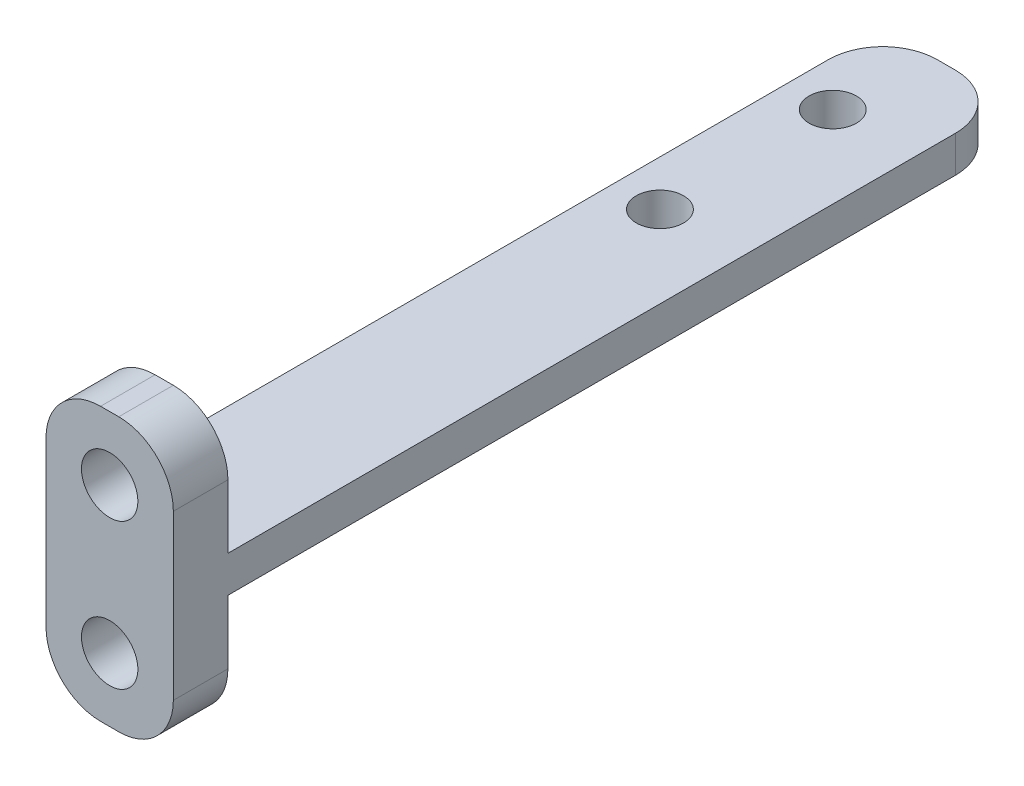
ISO-10303-21;
HEADER;
FILE_DESCRIPTION(('STEP AP214'),'2;1');
FILE_NAME('part.step','',(''),(''),'','','');
FILE_SCHEMA(('AUTOMOTIVE_DESIGN { 1 0 10303 214 1 1 1 1 }'));
ENDSEC;
DATA;
#1=APPLICATION_CONTEXT('core data for automotive mechanical design processes');
#2=APPLICATION_PROTOCOL_DEFINITION('international standard','automotive_design',2000,#1);
#3=PRODUCT_CONTEXT('',#1,'mechanical');
#4=PRODUCT('Part','Part','',(#3));
#5=PRODUCT_RELATED_PRODUCT_CATEGORY('part','',(#4));
#6=PRODUCT_DEFINITION_FORMATION('','',#4);
#7=PRODUCT_DEFINITION_CONTEXT('part definition',#1,'design');
#8=PRODUCT_DEFINITION('design','',#6,#7);
#9=PRODUCT_DEFINITION_SHAPE('','',#8);
#10=(LENGTH_UNIT() NAMED_UNIT(*) SI_UNIT(.MILLI.,.METRE.));
#11=(NAMED_UNIT(*) PLANE_ANGLE_UNIT() SI_UNIT($,.RADIAN.));
#12=(NAMED_UNIT(*) SI_UNIT($,.STERADIAN.) SOLID_ANGLE_UNIT());
#13=UNCERTAINTY_MEASURE_WITH_UNIT(LENGTH_MEASURE(1.E-05),#10,'distance_accuracy_value','');
#14=(GEOMETRIC_REPRESENTATION_CONTEXT(3) GLOBAL_UNCERTAINTY_ASSIGNED_CONTEXT((#13)) GLOBAL_UNIT_ASSIGNED_CONTEXT((#10,
#11,#12)) REPRESENTATION_CONTEXT('',''));
#15=CARTESIAN_POINT('',(0.,0.,0.));
#16=DIRECTION('',(0.,0.,1.));
#17=DIRECTION('',(1.,0.,0.));
#18=AXIS2_PLACEMENT_3D('',#15,#16,#17);
#19=CARTESIAN_POINT('',(0.,2.,0.));
#20=DIRECTION('',(0.,1.,0.));
#21=DIRECTION('',(0.,0.,1.));
#22=AXIS2_PLACEMENT_3D('',#19,#20,#21);
#23=PLANE('',#22);
#24=CARTESIAN_POINT('',(-1.,2.,-16.25));
#25=DIRECTION('',(0.,1.,0.));
#26=DIRECTION('',(0.,0.,1.));
#27=AXIS2_PLACEMENT_3D('',#24,#25,#26);
#28=CIRCLE('',#27,1.3);
#29=CARTESIAN_POINT('',(-1.,2.,-14.95));
#30=VERTEX_POINT('',#29);
#31=EDGE_CURVE('E173',#30,#30,#28,.T.);
#32=ORIENTED_EDGE('',*,*,#31,.F.);
#33=EDGE_LOOP('',(#32));
#34=FACE_BOUND('',#33,.T.);
#35=DIRECTION('',(-1.,0.,0.));
#36=VECTOR('',#35,1.);
#37=CARTESIAN_POINT('',(3.5,2.,-21.5));
#38=LINE('',#37,#36);
#39=CARTESIAN_POINT('',(0.5,2.,-21.5));
#40=VERTEX_POINT('',#39);
#41=CARTESIAN_POINT('',(-0.5,2.,-21.5));
#42=VERTEX_POINT('',#41);
#43=EDGE_CURVE('E199',#40,#42,#38,.T.);
#44=ORIENTED_EDGE('',*,*,#43,.T.);
#45=CARTESIAN_POINT('',(-0.5,2.,-18.5));
#46=DIRECTION('',(0.,1.,0.));
#47=DIRECTION('',(0.,0.,1.));
#48=AXIS2_PLACEMENT_3D('',#45,#46,#47);
#49=CIRCLE('',#48,3.);
#50=CARTESIAN_POINT('',(-3.5,2.,-18.5));
#51=VERTEX_POINT('',#50);
#52=EDGE_CURVE('E215',#42,#51,#49,.T.);
#53=ORIENTED_EDGE('',*,*,#52,.T.);
#54=DIRECTION('',(0.,0.,1.));
#55=VECTOR('',#54,1.);
#56=CARTESIAN_POINT('',(-3.5,2.,21.5));
#57=LINE('',#56,#55);
#58=CARTESIAN_POINT('',(-3.5,2.,21.5));
#59=VERTEX_POINT('',#58);
#60=EDGE_CURVE('E189',#51,#59,#57,.T.);
#61=ORIENTED_EDGE('',*,*,#60,.T.);
#62=DIRECTION('',(1.,0.,0.));
#63=VECTOR('',#62,1.);
#64=CARTESIAN_POINT('',(3.5,2.,21.5));
#65=LINE('',#64,#63);
#66=CARTESIAN_POINT('',(3.5,2.,21.5));
#67=VERTEX_POINT('',#66);
#68=EDGE_CURVE('E327',#59,#67,#65,.T.);
#69=ORIENTED_EDGE('',*,*,#68,.T.);
#70=DIRECTION('',(0.,0.,-1.));
#71=VECTOR('',#70,1.);
#72=CARTESIAN_POINT('',(3.5,2.,21.5));
#73=LINE('',#72,#71);
#74=CARTESIAN_POINT('',(3.5,2.,-18.5));
#75=VERTEX_POINT('',#74);
#76=EDGE_CURVE('E276',#67,#75,#73,.T.);
#77=ORIENTED_EDGE('',*,*,#76,.T.);
#78=CARTESIAN_POINT('',(0.5,2.,-18.5));
#79=DIRECTION('',(0.,1.,0.));
#80=DIRECTION('',(0.,0.,1.));
#81=AXIS2_PLACEMENT_3D('',#78,#79,#80);
#82=CIRCLE('',#81,3.);
#83=EDGE_CURVE('E212',#75,#40,#82,.T.);
#84=ORIENTED_EDGE('',*,*,#83,.T.);
#85=EDGE_LOOP('',(#44,#53,#61,#69,#77,#84));
#86=FACE_BOUND('',#85,.T.);
#87=CARTESIAN_POINT('',(-0.999999999999999,2.,-6.75000000000001));
#88=DIRECTION('',(0.,1.,0.));
#89=DIRECTION('',(0.,0.,-1.));
#90=AXIS2_PLACEMENT_3D('',#87,#88,#89);
#91=CIRCLE('',#90,1.3);
#92=CARTESIAN_POINT('',(-0.999999999999999,2.,-8.05000000000001));
#93=VERTEX_POINT('',#92);
#94=EDGE_CURVE('E311',#93,#93,#91,.T.);
#95=ORIENTED_EDGE('',*,*,#94,.F.);
#96=EDGE_LOOP('',(#95));
#97=FACE_BOUND('',#96,.T.);
#98=ADVANCED_FACE('F45',(#34,#86,#97),#23,.T.);
#99=CARTESIAN_POINT('',(0.,0.,0.));
#100=DIRECTION('',(0.,1.,0.));
#101=DIRECTION('',(0.,0.,1.));
#102=AXIS2_PLACEMENT_3D('',#99,#100,#101);
#103=PLANE('',#102);
#104=DIRECTION('',(0.,0.,1.));
#105=VECTOR('',#104,1.);
#106=CARTESIAN_POINT('',(-3.5,0.,21.5));
#107=LINE('',#106,#105);
#108=CARTESIAN_POINT('',(-3.5,0.,-18.5));
#109=VERTEX_POINT('',#108);
#110=CARTESIAN_POINT('',(-3.5,0.,21.5));
#111=VERTEX_POINT('',#110);
#112=EDGE_CURVE('E166',#109,#111,#107,.T.);
#113=ORIENTED_EDGE('',*,*,#112,.F.);
#114=CARTESIAN_POINT('',(-0.5,0.,-18.5));
#115=DIRECTION('',(0.,1.,0.));
#116=DIRECTION('',(0.,0.,1.));
#117=AXIS2_PLACEMENT_3D('',#114,#115,#116);
#118=CIRCLE('',#117,3.);
#119=CARTESIAN_POINT('',(-0.5,0.,-21.5));
#120=VERTEX_POINT('',#119);
#121=EDGE_CURVE('E202',#109,#120,#118,.F.);
#122=ORIENTED_EDGE('',*,*,#121,.T.);
#123=DIRECTION('',(-1.,0.,0.));
#124=VECTOR('',#123,1.);
#125=CARTESIAN_POINT('',(3.5,0.,-21.5));
#126=LINE('',#125,#124);
#127=CARTESIAN_POINT('',(0.5,0.,-21.5));
#128=VERTEX_POINT('',#127);
#129=EDGE_CURVE('E182',#128,#120,#126,.T.);
#130=ORIENTED_EDGE('',*,*,#129,.F.);
#131=CARTESIAN_POINT('',(0.5,0.,-18.5));
#132=DIRECTION('',(0.,1.,0.));
#133=DIRECTION('',(0.,0.,1.));
#134=AXIS2_PLACEMENT_3D('',#131,#132,#133);
#135=CIRCLE('',#134,3.);
#136=CARTESIAN_POINT('',(3.5,0.,-18.5));
#137=VERTEX_POINT('',#136);
#138=EDGE_CURVE('E198',#128,#137,#135,.F.);
#139=ORIENTED_EDGE('',*,*,#138,.T.);
#140=DIRECTION('',(0.,0.,-1.));
#141=VECTOR('',#140,1.);
#142=CARTESIAN_POINT('',(3.5,0.,21.5));
#143=LINE('',#142,#141);
#144=CARTESIAN_POINT('',(3.5,0.,21.5));
#145=VERTEX_POINT('',#144);
#146=EDGE_CURVE('E178',#145,#137,#143,.T.);
#147=ORIENTED_EDGE('',*,*,#146,.F.);
#148=DIRECTION('',(1.,0.,0.));
#149=VECTOR('',#148,1.);
#150=CARTESIAN_POINT('',(3.5,0.,21.5));
#151=LINE('',#150,#149);
#152=EDGE_CURVE('E153',#111,#145,#151,.T.);
#153=ORIENTED_EDGE('',*,*,#152,.F.);
#154=EDGE_LOOP('',(#113,#122,#130,#139,#147,#153));
#155=FACE_BOUND('',#154,.T.);
#156=CARTESIAN_POINT('',(-1.,0.,-16.25));
#157=DIRECTION('',(0.,1.,0.));
#158=DIRECTION('',(0.,0.,1.));
#159=AXIS2_PLACEMENT_3D('',#156,#157,#158);
#160=CIRCLE('',#159,1.3);
#161=CARTESIAN_POINT('',(-1.,0.,-14.95));
#162=VERTEX_POINT('',#161);
#163=EDGE_CURVE('E315',#162,#162,#160,.T.);
#164=ORIENTED_EDGE('',*,*,#163,.T.);
#165=EDGE_LOOP('',(#164));
#166=FACE_BOUND('',#165,.T.);
#167=CARTESIAN_POINT('',(-0.999999999999999,0.,-6.75000000000001));
#168=DIRECTION('',(0.,1.,0.));
#169=DIRECTION('',(0.,0.,-1.));
#170=AXIS2_PLACEMENT_3D('',#167,#168,#169);
#171=CIRCLE('',#170,1.3);
#172=CARTESIAN_POINT('',(-0.999999999999999,0.,-8.05000000000001));
#173=VERTEX_POINT('',#172);
#174=EDGE_CURVE('E306',#173,#173,#171,.T.);
#175=ORIENTED_EDGE('',*,*,#174,.T.);
#176=EDGE_LOOP('',(#175));
#177=FACE_BOUND('',#176,.T.);
#178=ADVANCED_FACE('F175',(#155,#166,#177),#103,.F.);
#179=CARTESIAN_POINT('',(-3.5,2.,21.5));
#180=DIRECTION('',(1.,0.,0.));
#181=DIRECTION('',(0.,0.,-1.));
#182=AXIS2_PLACEMENT_3D('',#179,#180,#181);
#183=PLANE('',#182);
#184=DIRECTION('',(0.,1.,0.));
#185=VECTOR('',#184,1.);
#186=CARTESIAN_POINT('',(-3.5,-6.5,21.5));
#187=LINE('',#186,#185);
#188=CARTESIAN_POINT('',(-3.5,-3.5,21.5));
#189=VERTEX_POINT('',#188);
#190=EDGE_CURVE('E147',#189,#111,#187,.T.);
#191=ORIENTED_EDGE('',*,*,#190,.F.);
#192=DIRECTION('',(0.,0.,1.));
#193=VECTOR('',#192,1.);
#194=CARTESIAN_POINT('',(-3.5,-3.5,24.5));
#195=LINE('',#194,#193);
#196=CARTESIAN_POINT('',(-3.5,-3.5,24.5));
#197=VERTEX_POINT('',#196);
#198=EDGE_CURVE('E224',#189,#197,#195,.T.);
#199=ORIENTED_EDGE('',*,*,#198,.T.);
#200=DIRECTION('',(0.,1.,0.));
#201=VECTOR('',#200,1.);
#202=CARTESIAN_POINT('',(-3.5,-6.5,24.5));
#203=LINE('',#202,#201);
#204=CARTESIAN_POINT('',(-3.5,5.5,24.5));
#205=VERTEX_POINT('',#204);
#206=EDGE_CURVE('E161',#197,#205,#203,.T.);
#207=ORIENTED_EDGE('',*,*,#206,.T.);
#208=DIRECTION('',(0.,0.,1.));
#209=VECTOR('',#208,1.);
#210=CARTESIAN_POINT('',(-3.5,5.5,21.5));
#211=LINE('',#210,#209);
#212=CARTESIAN_POINT('',(-3.5,5.5,21.5));
#213=VERTEX_POINT('',#212);
#214=EDGE_CURVE('E221',#205,#213,#211,.F.);
#215=ORIENTED_EDGE('',*,*,#214,.T.);
#216=EDGE_CURVE('E162',#59,#213,#187,.T.);
#217=ORIENTED_EDGE('',*,*,#216,.F.);
#218=ORIENTED_EDGE('',*,*,#60,.F.);
#219=DIRECTION('',(0.,-1.,0.));
#220=VECTOR('',#219,1.);
#221=CARTESIAN_POINT('',(-3.5,2.,-18.5));
#222=LINE('',#221,#220);
#223=EDGE_CURVE('E170',#51,#109,#222,.T.);
#224=ORIENTED_EDGE('',*,*,#223,.T.);
#225=ORIENTED_EDGE('',*,*,#112,.T.);
#226=EDGE_LOOP('',(#191,#199,#207,#215,#217,#218,#224,#225));
#227=FACE_BOUND('',#226,.T.);
#228=ADVANCED_FACE('F167',(#227),#183,.F.);
#229=CARTESIAN_POINT('',(3.5,2.,21.5));
#230=DIRECTION('',(-1.,0.,0.));
#231=DIRECTION('',(0.,0.,1.));
#232=AXIS2_PLACEMENT_3D('',#229,#230,#231);
#233=PLANE('',#232);
#234=DIRECTION('',(0.,1.,0.));
#235=VECTOR('',#234,1.);
#236=CARTESIAN_POINT('',(3.5,-6.5,24.5));
#237=LINE('',#236,#235);
#238=CARTESIAN_POINT('',(3.5,-3.5,24.5));
#239=VERTEX_POINT('',#238);
#240=CARTESIAN_POINT('',(3.5,5.5,24.5));
#241=VERTEX_POINT('',#240);
#242=EDGE_CURVE('E288',#239,#241,#237,.T.);
#243=ORIENTED_EDGE('',*,*,#242,.F.);
#244=DIRECTION('',(0.,0.,-1.));
#245=VECTOR('',#244,1.);
#246=CARTESIAN_POINT('',(3.5,-3.5,21.5));
#247=LINE('',#246,#245);
#248=CARTESIAN_POINT('',(3.5,-3.5,21.5));
#249=VERTEX_POINT('',#248);
#250=EDGE_CURVE('E253',#239,#249,#247,.T.);
#251=ORIENTED_EDGE('',*,*,#250,.T.);
#252=DIRECTION('',(0.,1.,0.));
#253=VECTOR('',#252,1.);
#254=CARTESIAN_POINT('',(3.5,-6.5,21.5));
#255=LINE('',#254,#253);
#256=EDGE_CURVE('E278',#249,#145,#255,.T.);
#257=ORIENTED_EDGE('',*,*,#256,.T.);
#258=ORIENTED_EDGE('',*,*,#146,.T.);
#259=DIRECTION('',(0.,-1.,0.));
#260=VECTOR('',#259,1.);
#261=CARTESIAN_POINT('',(3.5,2.,-18.5));
#262=LINE('',#261,#260);
#263=EDGE_CURVE('E218',#137,#75,#262,.F.);
#264=ORIENTED_EDGE('',*,*,#263,.T.);
#265=ORIENTED_EDGE('',*,*,#76,.F.);
#266=CARTESIAN_POINT('',(3.5,5.5,21.5));
#267=VERTEX_POINT('',#266);
#268=EDGE_CURVE('E267',#67,#267,#255,.T.);
#269=ORIENTED_EDGE('',*,*,#268,.T.);
#270=DIRECTION('',(0.,0.,-1.));
#271=VECTOR('',#270,1.);
#272=CARTESIAN_POINT('',(3.5,5.5,21.5));
#273=LINE('',#272,#271);
#274=EDGE_CURVE('E250',#267,#241,#273,.F.);
#275=ORIENTED_EDGE('',*,*,#274,.T.);
#276=EDGE_LOOP('',(#243,#251,#257,#258,#264,#265,#269,#275));
#277=FACE_BOUND('',#276,.T.);
#278=ADVANCED_FACE('F273',(#277),#233,.F.);
#279=CARTESIAN_POINT('',(3.5,2.,-21.5));
#280=DIRECTION('',(0.,0.,1.));
#281=DIRECTION('',(1.,0.,0.));
#282=AXIS2_PLACEMENT_3D('',#279,#280,#281);
#283=PLANE('',#282);
#284=ORIENTED_EDGE('',*,*,#129,.T.);
#285=DIRECTION('',(0.,-1.,0.));
#286=VECTOR('',#285,1.);
#287=CARTESIAN_POINT('',(-0.5,2.,-21.5));
#288=LINE('',#287,#286);
#289=EDGE_CURVE('E209',#120,#42,#288,.F.);
#290=ORIENTED_EDGE('',*,*,#289,.T.);
#291=ORIENTED_EDGE('',*,*,#43,.F.);
#292=DIRECTION('',(0.,-1.,0.));
#293=VECTOR('',#292,1.);
#294=CARTESIAN_POINT('',(0.5,2.,-21.5));
#295=LINE('',#294,#293);
#296=EDGE_CURVE('E205',#40,#128,#295,.T.);
#297=ORIENTED_EDGE('',*,*,#296,.T.);
#298=EDGE_LOOP('',(#284,#290,#291,#297));
#299=FACE_BOUND('',#298,.T.);
#300=ADVANCED_FACE('F344',(#299),#283,.F.);
#301=CARTESIAN_POINT('',(-1.,2.,-16.25));
#302=DIRECTION('',(0.,-1.,0.));
#303=DIRECTION('',(0.,0.,-1.));
#304=AXIS2_PLACEMENT_3D('',#301,#302,#303);
#305=CYLINDRICAL_SURFACE('',#304,1.3);
#306=ORIENTED_EDGE('',*,*,#31,.T.);
#307=EDGE_LOOP('',(#306));
#308=FACE_BOUND('',#307,.T.);
#309=ORIENTED_EDGE('',*,*,#163,.F.);
#310=EDGE_LOOP('',(#309));
#311=FACE_BOUND('',#310,.T.);
#312=ADVANCED_FACE('F381',(#308,#311),#305,.F.);
#313=CARTESIAN_POINT('',(-0.999999999999999,2.,-6.75000000000001));
#314=DIRECTION('',(0.,-1.,0.));
#315=DIRECTION('',(0.,0.,-1.));
#316=AXIS2_PLACEMENT_3D('',#313,#314,#315);
#317=CYLINDRICAL_SURFACE('',#316,1.3);
#318=ORIENTED_EDGE('',*,*,#94,.T.);
#319=EDGE_LOOP('',(#318));
#320=FACE_BOUND('',#319,.T.);
#321=ORIENTED_EDGE('',*,*,#174,.F.);
#322=EDGE_LOOP('',(#321));
#323=FACE_BOUND('',#322,.T.);
#324=ADVANCED_FACE('F480',(#320,#323),#317,.F.);
#325=CARTESIAN_POINT('',(3.5,-6.5,21.5));
#326=DIRECTION('',(0.,0.,-1.));
#327=DIRECTION('',(-1.,0.,0.));
#328=AXIS2_PLACEMENT_3D('',#325,#326,#327);
#329=PLANE('',#328);
#330=CARTESIAN_POINT('',(0.,5.,21.5));
#331=DIRECTION('',(0.,0.,-1.));
#332=DIRECTION('',(-1.,0.,0.));
#333=AXIS2_PLACEMENT_3D('',#330,#331,#332);
#334=CIRCLE('',#333,1.55);
#335=CARTESIAN_POINT('',(-1.55,5.,21.5));
#336=VERTEX_POINT('',#335);
#337=EDGE_CURVE('E194',#336,#336,#334,.F.);
#338=ORIENTED_EDGE('',*,*,#337,.T.);
#339=EDGE_LOOP('',(#338));
#340=FACE_BOUND('',#339,.T.);
#341=ORIENTED_EDGE('',*,*,#216,.T.);
#342=CARTESIAN_POINT('',(-0.5,5.5,21.5));
#343=DIRECTION('',(0.,0.,-1.));
#344=DIRECTION('',(-1.,0.,0.));
#345=AXIS2_PLACEMENT_3D('',#342,#343,#344);
#346=CIRCLE('',#345,3.);
#347=CARTESIAN_POINT('',(-0.499999999999999,8.5,21.5));
#348=VERTEX_POINT('',#347);
#349=EDGE_CURVE('E11',#213,#348,#346,.T.);
#350=ORIENTED_EDGE('',*,*,#349,.T.);
#351=DIRECTION('',(-1.,0.,0.));
#352=VECTOR('',#351,1.);
#353=CARTESIAN_POINT('',(3.5,8.5,21.5));
#354=LINE('',#353,#352);
#355=CARTESIAN_POINT('',(0.5,8.5,21.5));
#356=VERTEX_POINT('',#355);
#357=EDGE_CURVE('E269',#356,#348,#354,.T.);
#358=ORIENTED_EDGE('',*,*,#357,.F.);
#359=CARTESIAN_POINT('',(0.5,5.5,21.5));
#360=DIRECTION('',(0.,0.,-1.));
#361=DIRECTION('',(-1.,0.,0.));
#362=AXIS2_PLACEMENT_3D('',#359,#360,#361);
#363=CIRCLE('',#362,3.);
#364=EDGE_CURVE('E54',#356,#267,#363,.T.);
#365=ORIENTED_EDGE('',*,*,#364,.T.);
#366=ORIENTED_EDGE('',*,*,#268,.F.);
#367=ORIENTED_EDGE('',*,*,#68,.F.);
#368=EDGE_LOOP('',(#341,#350,#358,#365,#366,#367));
#369=FACE_BOUND('',#368,.T.);
#370=ADVANCED_FACE('F265',(#340,#369),#329,.T.);
#371=CARTESIAN_POINT('',(3.5,-6.5,24.5));
#372=DIRECTION('',(0.,0.,1.));
#373=DIRECTION('',(1.,0.,0.));
#374=AXIS2_PLACEMENT_3D('',#371,#372,#373);
#375=PLANE('',#374);
#376=CARTESIAN_POINT('',(0.,5.,24.5));
#377=DIRECTION('',(0.,0.,1.));
#378=DIRECTION('',(1.,0.,0.));
#379=AXIS2_PLACEMENT_3D('',#376,#377,#378);
#380=CIRCLE('',#379,1.55);
#381=CARTESIAN_POINT('',(1.55,5.,24.5));
#382=VERTEX_POINT('',#381);
#383=EDGE_CURVE('E195',#382,#382,#380,.T.);
#384=ORIENTED_EDGE('',*,*,#383,.F.);
#385=EDGE_LOOP('',(#384));
#386=FACE_BOUND('',#385,.T.);
#387=CARTESIAN_POINT('',(0.,-3.,24.5));
#388=DIRECTION('',(0.,0.,1.));
#389=DIRECTION('',(-1.,0.,0.));
#390=AXIS2_PLACEMENT_3D('',#387,#388,#389);
#391=CIRCLE('',#390,1.55);
#392=CARTESIAN_POINT('',(-1.55,-3.,24.5));
#393=VERTEX_POINT('',#392);
#394=EDGE_CURVE('E551',#393,#393,#391,.T.);
#395=ORIENTED_EDGE('',*,*,#394,.F.);
#396=EDGE_LOOP('',(#395));
#397=FACE_BOUND('',#396,.T.);
#398=ORIENTED_EDGE('',*,*,#206,.F.);
#399=CARTESIAN_POINT('',(-0.5,-3.5,24.5));
#400=DIRECTION('',(0.,0.,1.));
#401=DIRECTION('',(1.,0.,0.));
#402=AXIS2_PLACEMENT_3D('',#399,#400,#401);
#403=CIRCLE('',#402,3.);
#404=CARTESIAN_POINT('',(-0.5,-6.5,24.5));
#405=VERTEX_POINT('',#404);
#406=EDGE_CURVE('E236',#197,#405,#403,.T.);
#407=ORIENTED_EDGE('',*,*,#406,.T.);
#408=DIRECTION('',(1.,0.,0.));
#409=VECTOR('',#408,1.);
#410=CARTESIAN_POINT('',(3.5,-6.5,24.5));
#411=LINE('',#410,#409);
#412=CARTESIAN_POINT('',(0.5,-6.5,24.5));
#413=VERTEX_POINT('',#412);
#414=EDGE_CURVE('E279',#405,#413,#411,.T.);
#415=ORIENTED_EDGE('',*,*,#414,.T.);
#416=CARTESIAN_POINT('',(0.5,-3.5,24.5));
#417=DIRECTION('',(0.,0.,1.));
#418=DIRECTION('',(1.,0.,0.));
#419=AXIS2_PLACEMENT_3D('',#416,#417,#418);
#420=CIRCLE('',#419,3.);
#421=EDGE_CURVE('E233',#413,#239,#420,.T.);
#422=ORIENTED_EDGE('',*,*,#421,.T.);
#423=ORIENTED_EDGE('',*,*,#242,.T.);
#424=CARTESIAN_POINT('',(0.5,5.5,24.5));
#425=DIRECTION('',(0.,0.,1.));
#426=DIRECTION('',(1.,0.,0.));
#427=AXIS2_PLACEMENT_3D('',#424,#425,#426);
#428=CIRCLE('',#427,3.);
#429=CARTESIAN_POINT('',(0.5,8.5,24.5));
#430=VERTEX_POINT('',#429);
#431=EDGE_CURVE('E227',#241,#430,#428,.T.);
#432=ORIENTED_EDGE('',*,*,#431,.T.);
#433=DIRECTION('',(1.,0.,0.));
#434=VECTOR('',#433,1.);
#435=CARTESIAN_POINT('',(3.5,8.5,24.5));
#436=LINE('',#435,#434);
#437=CARTESIAN_POINT('',(-0.5,8.5,24.5));
#438=VERTEX_POINT('',#437);
#439=EDGE_CURVE('E287',#438,#430,#436,.T.);
#440=ORIENTED_EDGE('',*,*,#439,.F.);
#441=CARTESIAN_POINT('',(-0.5,5.5,24.5));
#442=DIRECTION('',(0.,0.,1.));
#443=DIRECTION('',(1.,0.,0.));
#444=AXIS2_PLACEMENT_3D('',#441,#442,#443);
#445=CIRCLE('',#444,3.);
#446=EDGE_CURVE('E230',#438,#205,#445,.T.);
#447=ORIENTED_EDGE('',*,*,#446,.T.);
#448=EDGE_LOOP('',(#398,#407,#415,#422,#423,#432,#440,#447));
#449=FACE_BOUND('',#448,.T.);
#450=ADVANCED_FACE('F286',(#386,#397,#449),#375,.T.);
#451=CARTESIAN_POINT('',(0.,-3.,21.5));
#452=DIRECTION('',(0.,0.,-1.));
#453=DIRECTION('',(-1.,0.,0.));
#454=AXIS2_PLACEMENT_3D('',#451,#452,#453);
#455=CIRCLE('',#454,1.55);
#456=CARTESIAN_POINT('',(-1.55,-3.,21.5));
#457=VERTEX_POINT('',#456);
#458=EDGE_CURVE('E190',#457,#457,#455,.F.);
#459=ORIENTED_EDGE('',*,*,#458,.T.);
#460=EDGE_LOOP('',(#459));
#461=FACE_BOUND('',#460,.T.);
#462=DIRECTION('',(-1.,0.,0.));
#463=VECTOR('',#462,1.);
#464=CARTESIAN_POINT('',(3.5,-6.5,21.5));
#465=LINE('',#464,#463);
#466=CARTESIAN_POINT('',(0.5,-6.5,21.5));
#467=VERTEX_POINT('',#466);
#468=CARTESIAN_POINT('',(-0.499999999999999,-6.5,21.5));
#469=VERTEX_POINT('',#468);
#470=EDGE_CURVE('E293',#467,#469,#465,.T.);
#471=ORIENTED_EDGE('',*,*,#470,.T.);
#472=CARTESIAN_POINT('',(-0.5,-3.5,21.5));
#473=DIRECTION('',(0.,0.,-1.));
#474=DIRECTION('',(-1.,0.,0.));
#475=AXIS2_PLACEMENT_3D('',#472,#473,#474);
#476=CIRCLE('',#475,3.);
#477=EDGE_CURVE('E156',#469,#189,#476,.T.);
#478=ORIENTED_EDGE('',*,*,#477,.T.);
#479=ORIENTED_EDGE('',*,*,#190,.T.);
#480=ORIENTED_EDGE('',*,*,#152,.T.);
#481=ORIENTED_EDGE('',*,*,#256,.F.);
#482=CARTESIAN_POINT('',(0.5,-3.5,21.5));
#483=DIRECTION('',(0.,0.,-1.));
#484=DIRECTION('',(-1.,0.,0.));
#485=AXIS2_PLACEMENT_3D('',#482,#483,#484);
#486=CIRCLE('',#485,3.);
#487=EDGE_CURVE('E245',#249,#467,#486,.T.);
#488=ORIENTED_EDGE('',*,*,#487,.T.);
#489=EDGE_LOOP('',(#471,#478,#479,#480,#481,#488));
#490=FACE_BOUND('',#489,.T.);
#491=ADVANCED_FACE('F150',(#461,#490),#329,.T.);
#492=CARTESIAN_POINT('',(0.,-6.5,0.));
#493=DIRECTION('',(0.,-1.,0.));
#494=DIRECTION('',(0.,0.,-1.));
#495=AXIS2_PLACEMENT_3D('',#492,#493,#494);
#496=PLANE('',#495);
#497=ORIENTED_EDGE('',*,*,#414,.F.);
#498=DIRECTION('',(0.,0.,1.));
#499=VECTOR('',#498,1.);
#500=CARTESIAN_POINT('',(-0.5,-6.5,21.5));
#501=LINE('',#500,#499);
#502=EDGE_CURVE('E242',#405,#469,#501,.F.);
#503=ORIENTED_EDGE('',*,*,#502,.T.);
#504=ORIENTED_EDGE('',*,*,#470,.F.);
#505=DIRECTION('',(0.,0.,-1.));
#506=VECTOR('',#505,1.);
#507=CARTESIAN_POINT('',(0.5,-6.5,24.5));
#508=LINE('',#507,#506);
#509=EDGE_CURVE('E239',#467,#413,#508,.F.);
#510=ORIENTED_EDGE('',*,*,#509,.T.);
#511=EDGE_LOOP('',(#497,#503,#504,#510));
#512=FACE_BOUND('',#511,.T.);
#513=ADVANCED_FACE('F354',(#512),#496,.T.);
#514=CARTESIAN_POINT('',(0.,8.5,0.));
#515=DIRECTION('',(0.,-1.,0.));
#516=DIRECTION('',(0.,0.,-1.));
#517=AXIS2_PLACEMENT_3D('',#514,#515,#516);
#518=PLANE('',#517);
#519=ORIENTED_EDGE('',*,*,#357,.T.);
#520=DIRECTION('',(0.,0.,1.));
#521=VECTOR('',#520,1.);
#522=CARTESIAN_POINT('',(-0.5,8.5,0.));
#523=LINE('',#522,#521);
#524=EDGE_CURVE('E260',#348,#438,#523,.T.);
#525=ORIENTED_EDGE('',*,*,#524,.T.);
#526=ORIENTED_EDGE('',*,*,#439,.T.);
#527=DIRECTION('',(0.,0.,-1.));
#528=VECTOR('',#527,1.);
#529=CARTESIAN_POINT('',(0.5,8.5,0.));
#530=LINE('',#529,#528);
#531=EDGE_CURVE('E257',#430,#356,#530,.T.);
#532=ORIENTED_EDGE('',*,*,#531,.T.);
#533=EDGE_LOOP('',(#519,#525,#526,#532));
#534=FACE_BOUND('',#533,.T.);
#535=ADVANCED_FACE('F290',(#534),#518,.F.);
#536=CARTESIAN_POINT('',(0.,-3.,24.5));
#537=DIRECTION('',(0.,0.,-1.));
#538=DIRECTION('',(-1.,0.,0.));
#539=AXIS2_PLACEMENT_3D('',#536,#537,#538);
#540=CYLINDRICAL_SURFACE('',#539,1.55);
#541=ORIENTED_EDGE('',*,*,#458,.F.);
#542=EDGE_LOOP('',(#541));
#543=FACE_BOUND('',#542,.T.);
#544=ORIENTED_EDGE('',*,*,#394,.T.);
#545=EDGE_LOOP('',(#544));
#546=FACE_BOUND('',#545,.T.);
#547=ADVANCED_FACE('F436',(#543,#546),#540,.F.);
#548=CARTESIAN_POINT('',(0.,5.,24.5));
#549=DIRECTION('',(0.,0.,-1.));
#550=DIRECTION('',(-1.,0.,0.));
#551=AXIS2_PLACEMENT_3D('',#548,#549,#550);
#552=CYLINDRICAL_SURFACE('',#551,1.55);
#553=ORIENTED_EDGE('',*,*,#337,.F.);
#554=EDGE_LOOP('',(#553));
#555=FACE_BOUND('',#554,.T.);
#556=ORIENTED_EDGE('',*,*,#383,.T.);
#557=EDGE_LOOP('',(#556));
#558=FACE_BOUND('',#557,.T.);
#559=ADVANCED_FACE('F392',(#555,#558),#552,.F.);
#560=CARTESIAN_POINT('',(-0.5,2.,-18.5));
#561=DIRECTION('',(0.,-1.,0.));
#562=DIRECTION('',(0.,0.,-1.));
#563=AXIS2_PLACEMENT_3D('',#560,#561,#562);
#564=CYLINDRICAL_SURFACE('',#563,3.);
#565=ORIENTED_EDGE('',*,*,#52,.F.);
#566=ORIENTED_EDGE('',*,*,#289,.F.);
#567=ORIENTED_EDGE('',*,*,#121,.F.);
#568=ORIENTED_EDGE('',*,*,#223,.F.);
#569=EDGE_LOOP('',(#565,#566,#567,#568));
#570=FACE_BOUND('',#569,.T.);
#571=ADVANCED_FACE('F342',(#570),#564,.T.);
#572=CARTESIAN_POINT('',(0.5,2.,-18.5));
#573=DIRECTION('',(0.,-1.,0.));
#574=DIRECTION('',(0.,0.,-1.));
#575=AXIS2_PLACEMENT_3D('',#572,#573,#574);
#576=CYLINDRICAL_SURFACE('',#575,3.);
#577=ORIENTED_EDGE('',*,*,#83,.F.);
#578=ORIENTED_EDGE('',*,*,#263,.F.);
#579=ORIENTED_EDGE('',*,*,#138,.F.);
#580=ORIENTED_EDGE('',*,*,#296,.F.);
#581=EDGE_LOOP('',(#577,#578,#579,#580));
#582=FACE_BOUND('',#581,.T.);
#583=ADVANCED_FACE('F346',(#582),#576,.T.);
#584=CARTESIAN_POINT('',(-0.5,-3.5,21.5));
#585=DIRECTION('',(0.,0.,-1.));
#586=DIRECTION('',(-1.,0.,0.));
#587=AXIS2_PLACEMENT_3D('',#584,#585,#586);
#588=CYLINDRICAL_SURFACE('',#587,3.);
#589=ORIENTED_EDGE('',*,*,#477,.F.);
#590=ORIENTED_EDGE('',*,*,#502,.F.);
#591=ORIENTED_EDGE('',*,*,#406,.F.);
#592=ORIENTED_EDGE('',*,*,#198,.F.);
#593=EDGE_LOOP('',(#589,#590,#591,#592));
#594=FACE_BOUND('',#593,.T.);
#595=ADVANCED_FACE('F359',(#594),#588,.T.);
#596=CARTESIAN_POINT('',(0.5,-3.5,21.5));
#597=DIRECTION('',(0.,0.,1.));
#598=DIRECTION('',(1.,0.,0.));
#599=AXIS2_PLACEMENT_3D('',#596,#597,#598);
#600=CYLINDRICAL_SURFACE('',#599,3.);
#601=ORIENTED_EDGE('',*,*,#421,.F.);
#602=ORIENTED_EDGE('',*,*,#509,.F.);
#603=ORIENTED_EDGE('',*,*,#487,.F.);
#604=ORIENTED_EDGE('',*,*,#250,.F.);
#605=EDGE_LOOP('',(#601,#602,#603,#604));
#606=FACE_BOUND('',#605,.T.);
#607=ADVANCED_FACE('F357',(#606),#600,.T.);
#608=CARTESIAN_POINT('',(-0.5,5.5,0.));
#609=DIRECTION('',(0.,0.,1.));
#610=DIRECTION('',(1.,0.,0.));
#611=AXIS2_PLACEMENT_3D('',#608,#609,#610);
#612=CYLINDRICAL_SURFACE('',#611,3.);
#613=ORIENTED_EDGE('',*,*,#349,.F.);
#614=ORIENTED_EDGE('',*,*,#214,.F.);
#615=ORIENTED_EDGE('',*,*,#446,.F.);
#616=ORIENTED_EDGE('',*,*,#524,.F.);
#617=EDGE_LOOP('',(#613,#614,#615,#616));
#618=FACE_BOUND('',#617,.T.);
#619=ADVANCED_FACE('F362',(#618),#612,.T.);
#620=CARTESIAN_POINT('',(0.5,5.5,0.));
#621=DIRECTION('',(0.,0.,-1.));
#622=DIRECTION('',(-1.,0.,0.));
#623=AXIS2_PLACEMENT_3D('',#620,#621,#622);
#624=CYLINDRICAL_SURFACE('',#623,3.);
#625=ORIENTED_EDGE('',*,*,#431,.F.);
#626=ORIENTED_EDGE('',*,*,#274,.F.);
#627=ORIENTED_EDGE('',*,*,#364,.F.);
#628=ORIENTED_EDGE('',*,*,#531,.F.);
#629=EDGE_LOOP('',(#625,#626,#627,#628));
#630=FACE_BOUND('',#629,.T.);
#631=ADVANCED_FACE('F47',(#630),#624,.T.);
#632=CLOSED_SHELL('',(#98,#178,#228,#278,#300,#312,#324,#370,#450,#491,#513,#535,#547,#559,#571,
#583,#595,#607,#619,#631));
#633=MANIFOLD_SOLID_BREP('B2',#632);
#634=ADVANCED_BREP_SHAPE_REPRESENTATION('',(#18,#633),#14);
#635=SHAPE_DEFINITION_REPRESENTATION(#9,#634);
ENDSEC;
END-ISO-10303-21;
